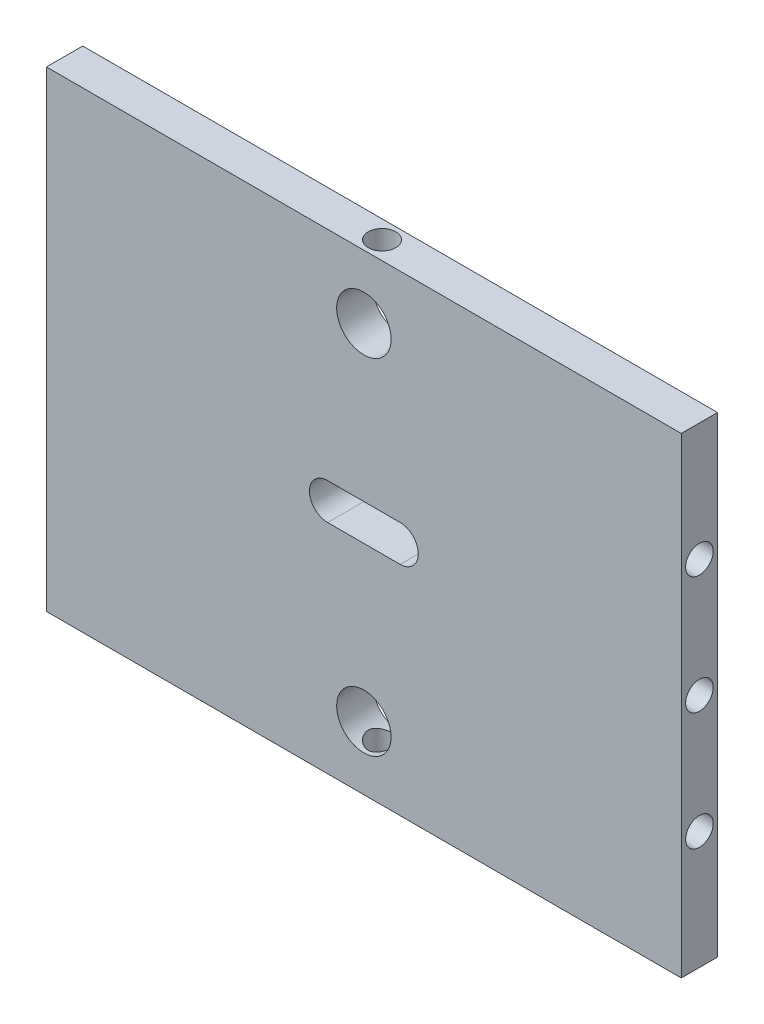
ISO-10303-21;
HEADER;
FILE_DESCRIPTION(('STEP AP214'),'2;1');
FILE_NAME('part.step','',(''),(''),'','','');
FILE_SCHEMA(('AUTOMOTIVE_DESIGN { 1 0 10303 214 1 1 1 1 }'));
ENDSEC;
DATA;
#1=APPLICATION_CONTEXT('core data for automotive mechanical design processes');
#2=APPLICATION_PROTOCOL_DEFINITION('international standard','automotive_design',2000,#1);
#3=PRODUCT_CONTEXT('',#1,'mechanical');
#4=PRODUCT('Part','Part','',(#3));
#5=PRODUCT_RELATED_PRODUCT_CATEGORY('part','',(#4));
#6=PRODUCT_DEFINITION_FORMATION('','',#4);
#7=PRODUCT_DEFINITION_CONTEXT('part definition',#1,'design');
#8=PRODUCT_DEFINITION('design','',#6,#7);
#9=PRODUCT_DEFINITION_SHAPE('','',#8);
#10=(LENGTH_UNIT() NAMED_UNIT(*) SI_UNIT(.MILLI.,.METRE.));
#11=(NAMED_UNIT(*) PLANE_ANGLE_UNIT() SI_UNIT($,.RADIAN.));
#12=(NAMED_UNIT(*) SI_UNIT($,.STERADIAN.) SOLID_ANGLE_UNIT());
#13=UNCERTAINTY_MEASURE_WITH_UNIT(LENGTH_MEASURE(1.E-05),#10,'distance_accuracy_value','');
#14=(GEOMETRIC_REPRESENTATION_CONTEXT(3) GLOBAL_UNCERTAINTY_ASSIGNED_CONTEXT((#13)) GLOBAL_UNIT_ASSIGNED_CONTEXT((#10,
#11,#12)) REPRESENTATION_CONTEXT('',''));
#15=CARTESIAN_POINT('',(0.,0.,0.));
#16=DIRECTION('',(0.,0.,1.));
#17=DIRECTION('',(1.,0.,0.));
#18=AXIS2_PLACEMENT_3D('',#15,#16,#17);
#19=CARTESIAN_POINT('',(55.5625,-41.275,6.35));
#20=DIRECTION('',(0.,1.,0.));
#21=DIRECTION('',(-1.,0.,0.));
#22=AXIS2_PLACEMENT_3D('',#19,#20,#21);
#23=PLANE('',#22);
#24=DIRECTION('',(1.,0.,0.));
#25=VECTOR('',#24,1.);
#26=CARTESIAN_POINT('',(55.5625,-41.275,0.));
#27=LINE('',#26,#25);
#28=CARTESIAN_POINT('',(-55.5625,-41.275,0.));
#29=VERTEX_POINT('',#28);
#30=CARTESIAN_POINT('',(55.5625,-41.275,0.));
#31=VERTEX_POINT('',#30);
#32=EDGE_CURVE('E196',#29,#31,#27,.T.);
#33=ORIENTED_EDGE('',*,*,#32,.T.);
#34=DIRECTION('',(0.,0.,-1.));
#35=VECTOR('',#34,1.);
#36=CARTESIAN_POINT('',(55.5625,-41.275,6.35));
#37=LINE('',#36,#35);
#38=CARTESIAN_POINT('',(55.5625,-41.275,6.35));
#39=VERTEX_POINT('',#38);
#40=EDGE_CURVE('E206',#39,#31,#37,.T.);
#41=ORIENTED_EDGE('',*,*,#40,.F.);
#42=DIRECTION('',(1.,0.,0.));
#43=VECTOR('',#42,1.);
#44=CARTESIAN_POINT('',(55.5625,-41.275,6.35));
#45=LINE('',#44,#43);
#46=CARTESIAN_POINT('',(-55.5625,-41.275,6.35));
#47=VERTEX_POINT('',#46);
#48=EDGE_CURVE('E186',#47,#39,#45,.T.);
#49=ORIENTED_EDGE('',*,*,#48,.F.);
#50=DIRECTION('',(0.,0.,-1.));
#51=VECTOR('',#50,1.);
#52=CARTESIAN_POINT('',(-55.5625,-41.275,6.35));
#53=LINE('',#52,#51);
#54=EDGE_CURVE('E209',#47,#29,#53,.T.);
#55=ORIENTED_EDGE('',*,*,#54,.T.);
#56=EDGE_LOOP('',(#33,#41,#49,#55));
#57=FACE_BOUND('',#56,.T.);
#58=CARTESIAN_POINT('',(0.,-41.275,3.175));
#59=DIRECTION('',(0.,1.,0.));
#60=DIRECTION('',(-1.,0.,0.));
#61=AXIS2_PLACEMENT_3D('',#58,#59,#60);
#62=CIRCLE('',#61,2.413);
#63=CARTESIAN_POINT('',(-2.41299999999999,-41.275,3.175));
#64=VERTEX_POINT('',#63);
#65=EDGE_CURVE('E124',#64,#64,#62,.T.);
#66=ORIENTED_EDGE('',*,*,#65,.T.);
#67=EDGE_LOOP('',(#66));
#68=FACE_BOUND('',#67,.T.);
#69=ADVANCED_FACE('F33',(#57,#68),#23,.F.);
#70=CARTESIAN_POINT('',(0.,-30.1625,6.35));
#71=DIRECTION('',(0.,0.,-1.));
#72=DIRECTION('',(-1.,0.,0.));
#73=AXIS2_PLACEMENT_3D('',#70,#71,#72);
#74=CYLINDRICAL_SURFACE('',#73,4.7625);
#75=CARTESIAN_POINT('',(0.,-30.1625,0.));
#76=DIRECTION('',(0.,0.,1.));
#77=DIRECTION('',(-1.,0.,0.));
#78=AXIS2_PLACEMENT_3D('',#75,#76,#77);
#79=CIRCLE('',#78,4.7625);
#80=CARTESIAN_POINT('',(-4.76249999999999,-30.1625,0.));
#81=VERTEX_POINT('',#80);
#82=EDGE_CURVE('E168',#81,#81,#79,.T.);
#83=ORIENTED_EDGE('',*,*,#82,.F.);
#84=EDGE_LOOP('',(#83));
#85=FACE_BOUND('',#84,.T.);
#86=CARTESIAN_POINT('',(0.,-30.1625,6.35));
#87=DIRECTION('',(0.,0.,1.));
#88=DIRECTION('',(-1.,0.,0.));
#89=AXIS2_PLACEMENT_3D('',#86,#87,#88);
#90=CIRCLE('',#89,4.7625);
#91=CARTESIAN_POINT('',(-4.76249999999999,-30.1625,6.35));
#92=VERTEX_POINT('',#91);
#93=EDGE_CURVE('E171',#92,#92,#90,.T.);
#94=ORIENTED_EDGE('',*,*,#93,.T.);
#95=EDGE_LOOP('',(#94));
#96=FACE_BOUND('',#95,.T.);
#97=CARTESIAN_POINT('',(2.41300000000001,-34.2684514427231,3.175));
#98=CARTESIAN_POINT('',(2.41298959719725,-34.2684642782932,3.30047043207857));
#99=CARTESIAN_POINT('',(2.40314718865454,-34.2742912555838,3.42609849758333));
#100=CARTESIAN_POINT('',(2.36428568016307,-34.2967507465352,3.67347477892594));
#101=CARTESIAN_POINT('',(2.33522736530901,-34.3134053555351,3.79521452596848));
#102=CARTESIAN_POINT('',(2.25952477625305,-34.3550877986089,4.030769610234));
#103=CARTESIAN_POINT('',(2.21297597061041,-34.3800700954961,4.14462406264938));
#104=CARTESIAN_POINT('',(2.10390518974434,-34.4355224660189,4.36287751327027));
#105=CARTESIAN_POINT('',(2.04138198754218,-34.4659929611449,4.46727578432047));
#106=CARTESIAN_POINT('',(1.89592129073469,-34.5321442044983,4.67342732710245));
#107=CARTESIAN_POINT('',(1.81170207851239,-34.5680476684607,4.77420517139413));
#108=CARTESIAN_POINT('',(1.62790296924237,-34.6392235569228,4.96096736840377));
#109=CARTESIAN_POINT('',(1.52831528093832,-34.6744956511623,5.04694417050078));
#110=CARTESIAN_POINT('',(1.30813045270683,-34.7433728760921,5.2075319339098));
#111=CARTESIAN_POINT('',(1.18655293508997,-34.7766906261296,5.28093358665196));
#112=CARTESIAN_POINT('',(0.930770162772574,-34.8349970482044,5.40579547408423));
#113=CARTESIAN_POINT('',(0.796573156353471,-34.8599911128632,5.45726992069383));
#114=CARTESIAN_POINT('',(0.529703085976592,-34.8972259875767,5.53292156586511));
#115=CARTESIAN_POINT('',(0.397629200091036,-34.9102622123706,5.55881198613326));
#116=CARTESIAN_POINT('',(0.130419357459133,-34.925089504113,5.58821217014395));
#117=CARTESIAN_POINT('',(-0.0047146362613206,-34.9268875859818,5.59173589534142));
#118=CARTESIAN_POINT('',(-0.261288495102825,-34.9194045392209,5.57694213264963));
#119=CARTESIAN_POINT('',(-0.382874270437069,-34.9110977758178,5.56054564514285));
#120=CARTESIAN_POINT('',(-0.621292363508594,-34.885822534913,5.50982779049476));
#121=CARTESIAN_POINT('',(-0.738124323984287,-34.8688534077055,5.47550507882298));
#122=CARTESIAN_POINT('',(-0.965723534567066,-34.8275141707143,5.38971157416185));
#123=CARTESIAN_POINT('',(-1.07638734206715,-34.8030470322369,5.33801505128527));
#124=CARTESIAN_POINT('',(-1.28773137967186,-34.7489008749861,5.21926657465877));
#125=CARTESIAN_POINT('',(-1.38840805165303,-34.719220009075,5.15220917623517));
#126=CARTESIAN_POINT('',(-1.5872768433047,-34.6540404063108,4.99722628783866));
#127=CARTESIAN_POINT('',(-1.6842943615511,-34.6182566519651,4.9079124546381));
#128=CARTESIAN_POINT('',(-1.86261687332044,-34.5467119984472,4.71465484311577));
#129=CARTESIAN_POINT('',(-1.94390921550487,-34.5109511405578,4.61069940044455));
#130=CARTESIAN_POINT('',(-2.09378503845431,-34.4409068679264,4.38266528962568));
#131=CARTESIAN_POINT('',(-2.1611638423934,-34.4068798578664,4.25770813256719));
#132=CARTESIAN_POINT('',(-2.27344012148107,-34.3478243240243,3.9961205849381));
#133=CARTESIAN_POINT('',(-2.31836154575336,-34.3227862223101,3.85950281241909));
#134=CARTESIAN_POINT('',(-2.38075232098653,-34.2873788042606,3.5899237169561));
#135=CARTESIAN_POINT('',(-2.40012752840259,-34.2759977087234,3.45754170909794));
#136=CARTESIAN_POINT('',(-2.41663192890407,-34.2663286993642,3.19096185622633));
#137=CARTESIAN_POINT('',(-2.4137778396488,-34.268030946133,3.0567654515499));
#138=CARTESIAN_POINT('',(-2.38765409638552,-34.2832616470244,2.80666634300608));
#139=CARTESIAN_POINT('',(-2.36674462939633,-34.2954222721502,2.69041968011811));
#140=CARTESIAN_POINT('',(-2.30864143407972,-34.3281553265606,2.46331899317455));
#141=CARTESIAN_POINT('',(-2.27144224606701,-34.3487305759492,2.35246679098655));
#142=CARTESIAN_POINT('',(-2.18002666174668,-34.3970801662797,2.13347042165862));
#143=CARTESIAN_POINT('',(-2.12510454857076,-34.425142767739,2.02568694529731));
#144=CARTESIAN_POINT('',(-2.00041157217394,-34.4850620484377,1.82023782562855));
#145=CARTESIAN_POINT('',(-1.93063306308114,-34.5169206775778,1.72257743081149));
#146=CARTESIAN_POINT('',(-1.76760250567714,-34.5858234602435,1.52684674893846));
#147=CARTESIAN_POINT('',(-1.6724774599989,-34.6230029165756,1.4303768962286));
#148=CARTESIAN_POINT('',(-1.46683882016201,-34.694789658719,1.25424873069539));
#149=CARTESIAN_POINT('',(-1.35631960201397,-34.7293959973679,1.17459658880315));
#150=CARTESIAN_POINT('',(-1.11866661604913,-34.7934341488521,1.03236901423491));
#151=CARTESIAN_POINT('',(-0.991142595441608,-34.8226858249857,0.970358728177169));
#152=CARTESIAN_POINT('',(-0.725564086775186,-34.8713345763698,0.869298241995003));
#153=CARTESIAN_POINT('',(-0.587519213640791,-34.890740528229,0.830227355382719));
#154=CARTESIAN_POINT('',(-0.318716713889223,-34.9160595250824,0.779604976418332));
#155=CARTESIAN_POINT('',(-0.188480545270583,-34.923062367338,0.765826368972122));
#156=CARTESIAN_POINT('',(0.0726155489410017,-34.9262328990153,0.759564702235895));
#157=CARTESIAN_POINT('',(0.203475226036689,-34.9224045946478,0.767073769090063));
#158=CARTESIAN_POINT('',(0.452608925002284,-34.9049768331079,0.801722738961749));
#159=CARTESIAN_POINT('',(0.571129388396251,-34.8920678190175,0.82747636285195));
#160=CARTESIAN_POINT('',(0.801961054799566,-34.8584426519233,0.89598079860148));
#161=CARTESIAN_POINT('',(0.914271387194137,-34.8377254074291,0.938733986827927));
#162=CARTESIAN_POINT('',(1.13480267260668,-34.7892605504202,1.0418727993198));
#163=CARTESIAN_POINT('',(1.24265424239447,-34.7612543979166,1.1029230643282));
#164=CARTESIAN_POINT('',(1.4470197310289,-34.7011018355011,1.2400917930215));
#165=CARTESIAN_POINT('',(1.5435284410426,-34.6689535375412,1.31621713668873));
#166=CARTESIAN_POINT('',(1.73283872849973,-34.5998229519975,1.49035967367612));
#167=CARTESIAN_POINT('',(1.82426234873218,-34.562681756181,1.58981666924796));
#168=CARTESIAN_POINT('',(1.98965098475985,-34.4904159810185,1.80310011518249));
#169=CARTESIAN_POINT('',(2.06359983116589,-34.4552932919555,1.9169397254815));
#170=CARTESIAN_POINT('',(2.1942476612967,-34.3900569759987,2.16127032390193));
#171=CARTESIAN_POINT('',(2.25023530606393,-34.3601673604939,2.29221115944626));
#172=CARTESIAN_POINT('',(2.31646335056276,-34.3237529237911,2.49554634679165));
#173=CARTESIAN_POINT('',(2.33557123649977,-34.3130239825891,2.56441372758246));
#174=CARTESIAN_POINT('',(2.36765850523188,-34.2948049420943,2.70396433617474));
#175=CARTESIAN_POINT('',(2.38064213124901,-34.2873126006123,2.77464627084623));
#176=CARTESIAN_POINT('',(2.39794173497482,-34.2772728821239,2.90029767745757));
#177=CARTESIAN_POINT('',(2.40358148617512,-34.273975041233,2.95502919936537));
#178=CARTESIAN_POINT('',(2.41111302876599,-34.2695614298812,3.06483033264054));
#179=CARTESIAN_POINT('',(2.41300456836541,-34.2684458060139,3.11989996647179));
#180=CARTESIAN_POINT('',(2.41300000000001,-34.2684514427231,3.175));
#181=B_SPLINE_CURVE_WITH_KNOTS('',3,(#97,#98,#99,#100,#101,#102,#103,#104,#105,#106,#107,#108,
#109,#110,#111,#112,#113,#114,#115,#116,#117,#118,#119,#120,#121,#122,#123,#124,#125,#126,#127,
#128,#129,#130,#131,#132,#133,#134,#135,#136,#137,#138,#139,#140,#141,#142,#143,#144,#145,#146,
#147,#148,#149,#150,#151,#152,#153,#154,#155,#156,#157,#158,#159,#160,#161,#162,#163,#164,#165,
#166,#167,#168,#169,#170,#171,#172,#173,#174,#175,#176,#177,#178,#179,#180),.UNSPECIFIED.,.T.,
.F.,(4,2,2,2,2,2,2,2,2,2,2,2,2,2,2,2,2,2,2,2,2,2,2,2,2,2,2,2,2,2,2,2,2,2,2,2,2,2,2,2,2,4),(0.,
0.37618822892474,0.753146543850161,1.12807650665735,1.50303527615293,1.90979790652876,
2.31676743228543,2.75209273661076,3.18713545790192,3.59053368294288,3.99368007907376,
4.36085058994704,4.72804864386794,5.1002148759916,5.47251322738946,5.88069274414447,
6.28919929911487,6.72487227779818,7.16007964726322,7.56053080596972,7.96068083237494,
8.31529503877274,8.67002818923127,9.04112183933797,9.41240693714612,9.8320075188292,
10.2517617982206,10.6837456980933,11.1153394390999,11.5066726658481,11.8978611656857,
12.262133362244,12.6264564982826,13.0060681057285,13.3858533617061,13.8043077188214,
14.2231477683155,14.6569640464722,14.8734832858582,15.0898522877214,15.2550433322878,
15.4202454734081),.UNSPECIFIED.);
#182=CARTESIAN_POINT('',(2.41300000000001,-34.2684514427231,3.175));
#183=VERTEX_POINT('',#182);
#184=EDGE_CURVE('E129',#183,#183,#181,.T.);
#185=ORIENTED_EDGE('',*,*,#184,.T.);
#186=EDGE_LOOP('',(#185));
#187=FACE_BOUND('',#186,.T.);
#188=ADVANCED_FACE('F282',(#85,#96,#187),#74,.F.);
#189=CARTESIAN_POINT('',(-55.5625,-41.275,6.35));
#190=DIRECTION('',(1.,0.,0.));
#191=DIRECTION('',(0.,0.,-1.));
#192=AXIS2_PLACEMENT_3D('',#189,#190,#191);
#193=PLANE('',#192);
#194=CARTESIAN_POINT('',(-55.5625,0.,3.175));
#195=DIRECTION('',(1.,0.,0.));
#196=DIRECTION('',(0.,0.,-1.));
#197=AXIS2_PLACEMENT_3D('',#194,#195,#196);
#198=CIRCLE('',#197,2.413);
#199=CARTESIAN_POINT('',(-55.5625,0.,0.762));
#200=VERTEX_POINT('',#199);
#201=EDGE_CURVE('E137',#200,#200,#198,.T.);
#202=ORIENTED_EDGE('',*,*,#201,.T.);
#203=EDGE_LOOP('',(#202));
#204=FACE_BOUND('',#203,.T.);
#205=DIRECTION('',(0.,-1.,0.));
#206=VECTOR('',#205,1.);
#207=CARTESIAN_POINT('',(-55.5625,-41.275,0.));
#208=LINE('',#207,#206);
#209=CARTESIAN_POINT('',(-55.5625,41.275,0.));
#210=VERTEX_POINT('',#209);
#211=EDGE_CURVE('E180',#210,#29,#208,.T.);
#212=ORIENTED_EDGE('',*,*,#211,.T.);
#213=ORIENTED_EDGE('',*,*,#54,.F.);
#214=DIRECTION('',(0.,-1.,0.));
#215=VECTOR('',#214,1.);
#216=CARTESIAN_POINT('',(-55.5625,-41.275,6.35));
#217=LINE('',#216,#215);
#218=CARTESIAN_POINT('',(-55.5625,41.275,6.35));
#219=VERTEX_POINT('',#218);
#220=EDGE_CURVE('E183',#219,#47,#217,.T.);
#221=ORIENTED_EDGE('',*,*,#220,.F.);
#222=DIRECTION('',(0.,0.,-1.));
#223=VECTOR('',#222,1.);
#224=CARTESIAN_POINT('',(-55.5625,41.275,6.35));
#225=LINE('',#224,#223);
#226=EDGE_CURVE('E193',#219,#210,#225,.T.);
#227=ORIENTED_EDGE('',*,*,#226,.T.);
#228=EDGE_LOOP('',(#212,#213,#221,#227));
#229=FACE_BOUND('',#228,.T.);
#230=CARTESIAN_POINT('',(-55.5625,20.6375,3.175));
#231=DIRECTION('',(1.,0.,0.));
#232=DIRECTION('',(0.,0.,-1.));
#233=AXIS2_PLACEMENT_3D('',#230,#231,#232);
#234=CIRCLE('',#233,2.413);
#235=CARTESIAN_POINT('',(-55.5625,20.6375,0.762));
#236=VERTEX_POINT('',#235);
#237=EDGE_CURVE('E144',#236,#236,#234,.T.);
#238=ORIENTED_EDGE('',*,*,#237,.T.);
#239=EDGE_LOOP('',(#238));
#240=FACE_BOUND('',#239,.T.);
#241=CARTESIAN_POINT('',(-55.5625,-20.6375,3.175));
#242=DIRECTION('',(1.,0.,0.));
#243=DIRECTION('',(0.,0.,-1.));
#244=AXIS2_PLACEMENT_3D('',#241,#242,#243);
#245=CIRCLE('',#244,2.413);
#246=CARTESIAN_POINT('',(-55.5625,-20.6375,0.762));
#247=VERTEX_POINT('',#246);
#248=EDGE_CURVE('E138',#247,#247,#245,.T.);
#249=ORIENTED_EDGE('',*,*,#248,.T.);
#250=EDGE_LOOP('',(#249));
#251=FACE_BOUND('',#250,.T.);
#252=ADVANCED_FACE('F35',(#204,#229,#240,#251),#193,.F.);
#253=CARTESIAN_POINT('',(0.,0.,6.35));
#254=DIRECTION('',(0.,0.,1.));
#255=DIRECTION('',(1.,0.,0.));
#256=AXIS2_PLACEMENT_3D('',#253,#254,#255);
#257=PLANE('',#256);
#258=CARTESIAN_POINT('',(-6.35,0.,6.35));
#259=DIRECTION('',(0.,0.,1.));
#260=DIRECTION('',(1.,0.,0.));
#261=AXIS2_PLACEMENT_3D('',#258,#259,#260);
#262=CIRCLE('',#261,3.175);
#263=CARTESIAN_POINT('',(-6.35,3.175,6.35));
#264=VERTEX_POINT('',#263);
#265=CARTESIAN_POINT('',(-6.35,-3.175,6.35));
#266=VERTEX_POINT('',#265);
#267=EDGE_CURVE('E48',#264,#266,#262,.T.);
#268=ORIENTED_EDGE('',*,*,#267,.F.);
#269=DIRECTION('',(-1.,0.,0.));
#270=VECTOR('',#269,1.);
#271=CARTESIAN_POINT('',(-6.35,3.175,6.35));
#272=LINE('',#271,#270);
#273=CARTESIAN_POINT('',(6.35,3.175,6.35));
#274=VERTEX_POINT('',#273);
#275=EDGE_CURVE('E117',#274,#264,#272,.T.);
#276=ORIENTED_EDGE('',*,*,#275,.F.);
#277=CARTESIAN_POINT('',(6.35,0.,6.35));
#278=DIRECTION('',(0.,0.,1.));
#279=DIRECTION('',(1.,0.,0.));
#280=AXIS2_PLACEMENT_3D('',#277,#278,#279);
#281=CIRCLE('',#280,3.175);
#282=CARTESIAN_POINT('',(6.35,-3.175,6.35));
#283=VERTEX_POINT('',#282);
#284=EDGE_CURVE('E101',#283,#274,#281,.T.);
#285=ORIENTED_EDGE('',*,*,#284,.F.);
#286=DIRECTION('',(1.,0.,0.));
#287=VECTOR('',#286,1.);
#288=CARTESIAN_POINT('',(-6.35,-3.175,6.35));
#289=LINE('',#288,#287);
#290=EDGE_CURVE('E110',#266,#283,#289,.T.);
#291=ORIENTED_EDGE('',*,*,#290,.F.);
#292=EDGE_LOOP('',(#268,#276,#285,#291));
#293=FACE_BOUND('',#292,.T.);
#294=CARTESIAN_POINT('',(0.,30.1625,6.35));
#295=DIRECTION('',(0.,0.,1.));
#296=DIRECTION('',(1.,0.,0.));
#297=AXIS2_PLACEMENT_3D('',#294,#295,#296);
#298=CIRCLE('',#297,4.7625);
#299=CARTESIAN_POINT('',(4.76250000000001,30.1625,6.35));
#300=VERTEX_POINT('',#299);
#301=EDGE_CURVE('E177',#300,#300,#298,.T.);
#302=ORIENTED_EDGE('',*,*,#301,.F.);
#303=EDGE_LOOP('',(#302));
#304=FACE_BOUND('',#303,.T.);
#305=ORIENTED_EDGE('',*,*,#220,.T.);
#306=ORIENTED_EDGE('',*,*,#48,.T.);
#307=DIRECTION('',(0.,1.,0.));
#308=VECTOR('',#307,1.);
#309=CARTESIAN_POINT('',(55.5625,-41.275,6.35));
#310=LINE('',#309,#308);
#311=CARTESIAN_POINT('',(55.5625,41.275,6.35));
#312=VERTEX_POINT('',#311);
#313=EDGE_CURVE('E189',#39,#312,#310,.T.);
#314=ORIENTED_EDGE('',*,*,#313,.T.);
#315=DIRECTION('',(-1.,0.,0.));
#316=VECTOR('',#315,1.);
#317=CARTESIAN_POINT('',(55.5625,41.275,6.35));
#318=LINE('',#317,#316);
#319=EDGE_CURVE('E191',#312,#219,#318,.T.);
#320=ORIENTED_EDGE('',*,*,#319,.T.);
#321=EDGE_LOOP('',(#305,#306,#314,#320));
#322=FACE_BOUND('',#321,.T.);
#323=ORIENTED_EDGE('',*,*,#93,.F.);
#324=EDGE_LOOP('',(#323));
#325=FACE_BOUND('',#324,.T.);
#326=ADVANCED_FACE('F114',(#293,#304,#322,#325),#257,.T.);
#327=CARTESIAN_POINT('',(0.,0.,0.));
#328=DIRECTION('',(0.,0.,1.));
#329=DIRECTION('',(1.,0.,0.));
#330=AXIS2_PLACEMENT_3D('',#327,#328,#329);
#331=PLANE('',#330);
#332=DIRECTION('',(-1.,0.,0.));
#333=VECTOR('',#332,1.);
#334=CARTESIAN_POINT('',(0.,3.175,0.));
#335=LINE('',#334,#333);
#336=CARTESIAN_POINT('',(6.35,3.175,0.));
#337=VERTEX_POINT('',#336);
#338=CARTESIAN_POINT('',(-6.35,3.175,0.));
#339=VERTEX_POINT('',#338);
#340=EDGE_CURVE('E41',#337,#339,#335,.T.);
#341=ORIENTED_EDGE('',*,*,#340,.T.);
#342=CARTESIAN_POINT('',(-6.35,0.,0.));
#343=DIRECTION('',(0.,0.,1.));
#344=DIRECTION('',(1.,0.,0.));
#345=AXIS2_PLACEMENT_3D('',#342,#343,#344);
#346=CIRCLE('',#345,3.175);
#347=CARTESIAN_POINT('',(-6.35,-3.175,0.));
#348=VERTEX_POINT('',#347);
#349=EDGE_CURVE('E11',#339,#348,#346,.T.);
#350=ORIENTED_EDGE('',*,*,#349,.T.);
#351=DIRECTION('',(1.,0.,0.));
#352=VECTOR('',#351,1.);
#353=CARTESIAN_POINT('',(0.,-3.175,0.));
#354=LINE('',#353,#352);
#355=CARTESIAN_POINT('',(6.35,-3.175,0.));
#356=VERTEX_POINT('',#355);
#357=EDGE_CURVE('E212',#348,#356,#354,.T.);
#358=ORIENTED_EDGE('',*,*,#357,.T.);
#359=CARTESIAN_POINT('',(6.35,0.,0.));
#360=DIRECTION('',(0.,0.,1.));
#361=DIRECTION('',(1.,0.,0.));
#362=AXIS2_PLACEMENT_3D('',#359,#360,#361);
#363=CIRCLE('',#362,3.175);
#364=EDGE_CURVE('E104',#356,#337,#363,.T.);
#365=ORIENTED_EDGE('',*,*,#364,.T.);
#366=EDGE_LOOP('',(#341,#350,#358,#365));
#367=FACE_BOUND('',#366,.T.);
#368=CARTESIAN_POINT('',(0.,30.1625,0.));
#369=DIRECTION('',(0.,0.,1.));
#370=DIRECTION('',(1.,0.,0.));
#371=AXIS2_PLACEMENT_3D('',#368,#369,#370);
#372=CIRCLE('',#371,4.7625);
#373=CARTESIAN_POINT('',(4.76250000000001,30.1625,0.));
#374=VERTEX_POINT('',#373);
#375=EDGE_CURVE('E174',#374,#374,#372,.T.);
#376=ORIENTED_EDGE('',*,*,#375,.T.);
#377=EDGE_LOOP('',(#376));
#378=FACE_BOUND('',#377,.T.);
#379=ORIENTED_EDGE('',*,*,#211,.F.);
#380=DIRECTION('',(-1.,0.,0.));
#381=VECTOR('',#380,1.);
#382=CARTESIAN_POINT('',(55.5625,41.275,0.));
#383=LINE('',#382,#381);
#384=CARTESIAN_POINT('',(55.5625,41.275,0.));
#385=VERTEX_POINT('',#384);
#386=EDGE_CURVE('E187',#385,#210,#383,.T.);
#387=ORIENTED_EDGE('',*,*,#386,.F.);
#388=DIRECTION('',(0.,1.,0.));
#389=VECTOR('',#388,1.);
#390=CARTESIAN_POINT('',(55.5625,-41.275,0.));
#391=LINE('',#390,#389);
#392=EDGE_CURVE('E198',#31,#385,#391,.T.);
#393=ORIENTED_EDGE('',*,*,#392,.F.);
#394=ORIENTED_EDGE('',*,*,#32,.F.);
#395=EDGE_LOOP('',(#379,#387,#393,#394));
#396=FACE_BOUND('',#395,.T.);
#397=ORIENTED_EDGE('',*,*,#82,.T.);
#398=EDGE_LOOP('',(#397));
#399=FACE_BOUND('',#398,.T.);
#400=ADVANCED_FACE('F447',(#367,#378,#396,#399),#331,.F.);
#401=CARTESIAN_POINT('',(55.5625,-41.275,6.35));
#402=DIRECTION('',(-1.,0.,0.));
#403=DIRECTION('',(0.,0.,1.));
#404=AXIS2_PLACEMENT_3D('',#401,#402,#403);
#405=PLANE('',#404);
#406=CARTESIAN_POINT('',(55.5625,-20.6375,3.175));
#407=DIRECTION('',(1.,0.,0.));
#408=DIRECTION('',(0.,0.,-1.));
#409=AXIS2_PLACEMENT_3D('',#406,#407,#408);
#410=CIRCLE('',#409,2.413);
#411=CARTESIAN_POINT('',(55.5625,-20.6375,0.762));
#412=VERTEX_POINT('',#411);
#413=EDGE_CURVE('E150',#412,#412,#410,.T.);
#414=ORIENTED_EDGE('',*,*,#413,.F.);
#415=EDGE_LOOP('',(#414));
#416=FACE_BOUND('',#415,.T.);
#417=CARTESIAN_POINT('',(55.5625,0.,3.175));
#418=DIRECTION('',(1.,0.,0.));
#419=DIRECTION('',(0.,0.,-1.));
#420=AXIS2_PLACEMENT_3D('',#417,#418,#419);
#421=CIRCLE('',#420,2.413);
#422=CARTESIAN_POINT('',(55.5625,0.,0.762));
#423=VERTEX_POINT('',#422);
#424=EDGE_CURVE('E156',#423,#423,#421,.T.);
#425=ORIENTED_EDGE('',*,*,#424,.F.);
#426=EDGE_LOOP('',(#425));
#427=FACE_BOUND('',#426,.T.);
#428=CARTESIAN_POINT('',(55.5625,20.6375,3.175));
#429=DIRECTION('',(1.,0.,0.));
#430=DIRECTION('',(0.,0.,-1.));
#431=AXIS2_PLACEMENT_3D('',#428,#429,#430);
#432=CIRCLE('',#431,2.413);
#433=CARTESIAN_POINT('',(55.5625,20.6375,0.762));
#434=VERTEX_POINT('',#433);
#435=EDGE_CURVE('E162',#434,#434,#432,.T.);
#436=ORIENTED_EDGE('',*,*,#435,.F.);
#437=EDGE_LOOP('',(#436));
#438=FACE_BOUND('',#437,.T.);
#439=ORIENTED_EDGE('',*,*,#392,.T.);
#440=DIRECTION('',(0.,0.,-1.));
#441=VECTOR('',#440,1.);
#442=CARTESIAN_POINT('',(55.5625,41.275,6.35));
#443=LINE('',#442,#441);
#444=EDGE_CURVE('E203',#312,#385,#443,.T.);
#445=ORIENTED_EDGE('',*,*,#444,.F.);
#446=ORIENTED_EDGE('',*,*,#313,.F.);
#447=ORIENTED_EDGE('',*,*,#40,.T.);
#448=EDGE_LOOP('',(#439,#445,#446,#447));
#449=FACE_BOUND('',#448,.T.);
#450=ADVANCED_FACE('F439',(#416,#427,#438,#449),#405,.F.);
#451=CARTESIAN_POINT('',(55.5625,41.275,6.35));
#452=DIRECTION('',(0.,-1.,0.));
#453=DIRECTION('',(1.,0.,0.));
#454=AXIS2_PLACEMENT_3D('',#451,#452,#453);
#455=PLANE('',#454);
#456=CARTESIAN_POINT('',(0.,41.275,3.175));
#457=DIRECTION('',(0.,1.,0.));
#458=DIRECTION('',(-1.,0.,0.));
#459=AXIS2_PLACEMENT_3D('',#456,#457,#458);
#460=CIRCLE('',#459,2.413);
#461=CARTESIAN_POINT('',(-2.41299999999999,41.275,3.175));
#462=VERTEX_POINT('',#461);
#463=EDGE_CURVE('E130',#462,#462,#460,.T.);
#464=ORIENTED_EDGE('',*,*,#463,.F.);
#465=EDGE_LOOP('',(#464));
#466=FACE_BOUND('',#465,.T.);
#467=ORIENTED_EDGE('',*,*,#386,.T.);
#468=ORIENTED_EDGE('',*,*,#226,.F.);
#469=ORIENTED_EDGE('',*,*,#319,.F.);
#470=ORIENTED_EDGE('',*,*,#444,.T.);
#471=EDGE_LOOP('',(#467,#468,#469,#470));
#472=FACE_BOUND('',#471,.T.);
#473=ADVANCED_FACE('F432',(#466,#472),#455,.F.);
#474=CARTESIAN_POINT('',(0.,30.1625,6.35));
#475=DIRECTION('',(0.,0.,-1.));
#476=DIRECTION('',(-1.,0.,0.));
#477=AXIS2_PLACEMENT_3D('',#474,#475,#476);
#478=CYLINDRICAL_SURFACE('',#477,4.7625);
#479=CARTESIAN_POINT('',(-2.41299999999999,34.2684514427231,3.175));
#480=CARTESIAN_POINT('',(-2.41298959719723,34.2684642782932,3.04952956792143));
#481=CARTESIAN_POINT('',(-2.40314718865452,34.2742912555838,2.92390150241667));
#482=CARTESIAN_POINT('',(-2.36428568016305,34.2967507465352,2.67652522107406));
#483=CARTESIAN_POINT('',(-2.33522736530899,34.3134053555351,2.55478547403152));
#484=CARTESIAN_POINT('',(-2.25952477625303,34.3550877986089,2.319230389766));
#485=CARTESIAN_POINT('',(-2.21297597061039,34.3800700954961,2.20537593735062));
#486=CARTESIAN_POINT('',(-2.10390518974432,34.4355224660189,1.98712248672973));
#487=CARTESIAN_POINT('',(-2.04138198754215,34.4659929611449,1.88272421567953));
#488=CARTESIAN_POINT('',(-1.89592129073467,34.5321442044983,1.67657267289755));
#489=CARTESIAN_POINT('',(-1.81170207851237,34.5680476684607,1.57579482860587));
#490=CARTESIAN_POINT('',(-1.62790296924235,34.6392235569228,1.38903263159623));
#491=CARTESIAN_POINT('',(-1.5283152809383,34.6744956511623,1.30305582949922));
#492=CARTESIAN_POINT('',(-1.30813045270681,34.7433728760921,1.1424680660902));
#493=CARTESIAN_POINT('',(-1.18655293508995,34.7766906261296,1.06906641334804));
#494=CARTESIAN_POINT('',(-0.930770162772554,34.8349970482044,0.944204525915773));
#495=CARTESIAN_POINT('',(-0.796573156353452,34.8599911128632,0.892730079306169));
#496=CARTESIAN_POINT('',(-0.529703085976573,34.8972259875767,0.817078434134892));
#497=CARTESIAN_POINT('',(-0.397629200091017,34.9102622123706,0.791188013866745));
#498=CARTESIAN_POINT('',(-0.130419357459115,34.925089504113,0.76178782985605));
#499=CARTESIAN_POINT('',(0.0047146362613396,34.9268875859818,0.75826410465858));
#500=CARTESIAN_POINT('',(0.261288495102843,34.9194045392209,0.773057867350371));
#501=CARTESIAN_POINT('',(0.382874270437086,34.9110977758178,0.789454354857148));
#502=CARTESIAN_POINT('',(0.621292363508612,34.885822534913,0.840172209505244));
#503=CARTESIAN_POINT('',(0.738124323984305,34.8688534077055,0.874494921177024));
#504=CARTESIAN_POINT('',(0.965723534567085,34.8275141707143,0.960288425838147));
#505=CARTESIAN_POINT('',(1.07638734206716,34.8030470322369,1.01198494871473));
#506=CARTESIAN_POINT('',(1.28773137967188,34.7489008749861,1.13073342534123));
#507=CARTESIAN_POINT('',(1.38840805165305,34.719220009075,1.19779082376483));
#508=CARTESIAN_POINT('',(1.58727684330472,34.6540404063108,1.35277371216134));
#509=CARTESIAN_POINT('',(1.68429436155112,34.6182566519651,1.4420875453619));
#510=CARTESIAN_POINT('',(1.86261687332046,34.5467119984472,1.63534515688423));
#511=CARTESIAN_POINT('',(1.94390921550489,34.5109511405578,1.73930059955545));
#512=CARTESIAN_POINT('',(2.09378503845433,34.4409068679264,1.96733471037432));
#513=CARTESIAN_POINT('',(2.16116384239342,34.4068798578664,2.09229186743281));
#514=CARTESIAN_POINT('',(2.27344012148109,34.3478243240243,2.3538794150619));
#515=CARTESIAN_POINT('',(2.31836154575338,34.3227862223101,2.49049718758091));
#516=CARTESIAN_POINT('',(2.38075232098655,34.2873788042606,2.7600762830439));
#517=CARTESIAN_POINT('',(2.40012752840261,34.2759977087234,2.89245829090206));
#518=CARTESIAN_POINT('',(2.41663192890409,34.2663286993641,3.15903814377367));
#519=CARTESIAN_POINT('',(2.41377783964882,34.268030946133,3.2932345484501));
#520=CARTESIAN_POINT('',(2.38765409638554,34.2832616470244,3.54333365699392));
#521=CARTESIAN_POINT('',(2.36674462939635,34.2954222721502,3.65958031988189));
#522=CARTESIAN_POINT('',(2.30864143407974,34.3281553265606,3.88668100682545));
#523=CARTESIAN_POINT('',(2.27144224606703,34.3487305759492,3.99753320901345));
#524=CARTESIAN_POINT('',(2.1800266617467,34.3970801662797,4.21652957834138));
#525=CARTESIAN_POINT('',(2.12510454857078,34.425142767739,4.32431305470269));
#526=CARTESIAN_POINT('',(2.00041157217396,34.4850620484377,4.52976217437145));
#527=CARTESIAN_POINT('',(1.93063306308116,34.5169206775778,4.62742256918851));
#528=CARTESIAN_POINT('',(1.76760250567716,34.5858234602435,4.82315325106154));
#529=CARTESIAN_POINT('',(1.67247745999892,34.6230029165756,4.9196231037714));
#530=CARTESIAN_POINT('',(1.46683882016203,34.694789658719,5.09575126930461));
#531=CARTESIAN_POINT('',(1.35631960201399,34.729395997368,5.17540341119684));
#532=CARTESIAN_POINT('',(1.11866661604915,34.7934341488521,5.31763098576508));
#533=CARTESIAN_POINT('',(0.99114259544163,34.8226858249857,5.37964127182283));
#534=CARTESIAN_POINT('',(0.725564086775207,34.8713345763698,5.480701758005));
#535=CARTESIAN_POINT('',(0.587519213640812,34.890740528229,5.51977264461728));
#536=CARTESIAN_POINT('',(0.318716713889244,34.9160595250824,5.57039502358167));
#537=CARTESIAN_POINT('',(0.188480545270604,34.923062367338,5.58417363102788));
#538=CARTESIAN_POINT('',(-0.0726155489409811,34.9262328990153,5.59043529776411));
#539=CARTESIAN_POINT('',(-0.203475226036669,34.9224045946478,5.58292623090994));
#540=CARTESIAN_POINT('',(-0.452608925002264,34.9049768331079,5.54827726103825));
#541=CARTESIAN_POINT('',(-0.571129388396231,34.8920678190175,5.52252363714805));
#542=CARTESIAN_POINT('',(-0.801961054799546,34.8584426519233,5.45401920139852));
#543=CARTESIAN_POINT('',(-0.914271387194117,34.8377254074291,5.41126601317207));
#544=CARTESIAN_POINT('',(-1.13480267260666,34.7892605504202,5.3081272006802));
#545=CARTESIAN_POINT('',(-1.24265424239445,34.7612543979166,5.2470769356718));
#546=CARTESIAN_POINT('',(-1.44701973102888,34.7011018355011,5.1099082069785));
#547=CARTESIAN_POINT('',(-1.54352844104258,34.6689535375412,5.03378286331128));
#548=CARTESIAN_POINT('',(-1.73283872849971,34.5998229519975,4.85964032632388));
#549=CARTESIAN_POINT('',(-1.82426234873216,34.562681756181,4.76018333075204));
#550=CARTESIAN_POINT('',(-1.98965098475983,34.4904159810185,4.54689988481751));
#551=CARTESIAN_POINT('',(-2.06359983116587,34.4552932919555,4.4330602745185));
#552=CARTESIAN_POINT('',(-2.19424766129668,34.3900569759987,4.18872967609807));
#553=CARTESIAN_POINT('',(-2.25023530606391,34.3601673604939,4.05778884055374));
#554=CARTESIAN_POINT('',(-2.31646335056274,34.3237529237911,3.85445365320835));
#555=CARTESIAN_POINT('',(-2.33557123649975,34.3130239825891,3.78558627241754));
#556=CARTESIAN_POINT('',(-2.36765850523186,34.2948049420943,3.64603566382526));
#557=CARTESIAN_POINT('',(-2.38064213124899,34.2873126006123,3.57535372915377));
#558=CARTESIAN_POINT('',(-2.3979417349748,34.2772728821239,3.44970232254243));
#559=CARTESIAN_POINT('',(-2.4035814861751,34.273975041233,3.39497080063464));
#560=CARTESIAN_POINT('',(-2.41111302876597,34.2695614298812,3.28516966735946));
#561=CARTESIAN_POINT('',(-2.41300456836539,34.2684458060139,3.23010003352821));
#562=CARTESIAN_POINT('',(-2.41299999999999,34.2684514427231,3.175));
#563=B_SPLINE_CURVE_WITH_KNOTS('',3,(#479,#480,#481,#482,#483,#484,#485,#486,#487,#488,#489,
#490,#491,#492,#493,#494,#495,#496,#497,#498,#499,#500,#501,#502,#503,#504,#505,#506,#507,#508,
#509,#510,#511,#512,#513,#514,#515,#516,#517,#518,#519,#520,#521,#522,#523,#524,#525,#526,#527,
#528,#529,#530,#531,#532,#533,#534,#535,#536,#537,#538,#539,#540,#541,#542,#543,#544,#545,#546,
#547,#548,#549,#550,#551,#552,#553,#554,#555,#556,#557,#558,#559,#560,#561,#562),.UNSPECIFIED.,
.T.,.F.,(4,2,2,2,2,2,2,2,2,2,2,2,2,2,2,2,2,2,2,2,2,2,2,2,2,2,2,2,2,2,2,2,2,2,2,2,2,2,2,2,2,4),
(0.,0.37618822892474,0.753146543850162,1.12807650665736,1.50303527615293,1.90979790652877,
2.31676743228543,2.75209273661076,3.18713545790192,3.59053368294287,3.99368007907376,
4.36085058994704,4.72804864386794,5.10021487599159,5.47251322738946,5.88069274414447,
6.28919929911486,6.72487227779818,7.16007964726322,7.56053080596972,7.96068083237494,
8.31529503877274,8.67002818923127,9.04112183933797,9.41240693714612,9.8320075188292,
10.2517617982206,10.6837456980933,11.1153394390999,11.5066726658481,11.8978611656857,
12.262133362244,12.6264564982826,13.0060681057285,13.3858533617061,13.8043077188214,
14.2231477683155,14.6569640464722,14.8734832858582,15.0898522877214,15.2550433322878,
15.4202454734081),.UNSPECIFIED.);
#564=CARTESIAN_POINT('',(-2.41299999999999,34.2684514427231,3.175));
#565=VERTEX_POINT('',#564);
#566=EDGE_CURVE('E133',#565,#565,#563,.T.);
#567=ORIENTED_EDGE('',*,*,#566,.F.);
#568=EDGE_LOOP('',(#567));
#569=FACE_BOUND('',#568,.T.);
#570=ORIENTED_EDGE('',*,*,#301,.T.);
#571=EDGE_LOOP('',(#570));
#572=FACE_BOUND('',#571,.T.);
#573=ORIENTED_EDGE('',*,*,#375,.F.);
#574=EDGE_LOOP('',(#573));
#575=FACE_BOUND('',#574,.T.);
#576=ADVANCED_FACE('F224',(#569,#572,#575),#478,.F.);
#577=CARTESIAN_POINT('',(42.8625,20.6375,3.175));
#578=DIRECTION('',(1.,0.,0.));
#579=DIRECTION('',(0.,0.,-1.));
#580=AXIS2_PLACEMENT_3D('',#577,#578,#579);
#581=CYLINDRICAL_SURFACE('',#580,2.413);
#582=CARTESIAN_POINT('',(42.8625,20.6375,3.175));
#583=DIRECTION('',(1.,0.,0.));
#584=DIRECTION('',(0.,0.,-1.));
#585=AXIS2_PLACEMENT_3D('',#582,#583,#584);
#586=CIRCLE('',#585,2.413);
#587=CARTESIAN_POINT('',(42.8625,20.6375,0.762));
#588=VERTEX_POINT('',#587);
#589=EDGE_CURVE('E165',#588,#588,#586,.T.);
#590=ORIENTED_EDGE('',*,*,#589,.F.);
#591=EDGE_LOOP('',(#590));
#592=FACE_BOUND('',#591,.T.);
#593=ORIENTED_EDGE('',*,*,#435,.T.);
#594=EDGE_LOOP('',(#593));
#595=FACE_BOUND('',#594,.T.);
#596=ADVANCED_FACE('F278',(#592,#595),#581,.F.);
#597=CARTESIAN_POINT('',(42.8625,20.6375,3.175));
#598=DIRECTION('',(1.,0.,0.));
#599=DIRECTION('',(0.,0.,-1.));
#600=AXIS2_PLACEMENT_3D('',#597,#598,#599);
#601=PLANE('',#600);
#602=ORIENTED_EDGE('',*,*,#589,.T.);
#603=EDGE_LOOP('',(#602));
#604=FACE_BOUND('',#603,.T.);
#605=ADVANCED_FACE('F274',(#604),#601,.T.);
#606=CARTESIAN_POINT('',(42.8625,0.,3.175));
#607=DIRECTION('',(1.,0.,0.));
#608=DIRECTION('',(0.,0.,-1.));
#609=AXIS2_PLACEMENT_3D('',#606,#607,#608);
#610=CYLINDRICAL_SURFACE('',#609,2.413);
#611=CARTESIAN_POINT('',(42.8625,0.,3.175));
#612=DIRECTION('',(1.,0.,0.));
#613=DIRECTION('',(0.,0.,-1.));
#614=AXIS2_PLACEMENT_3D('',#611,#612,#613);
#615=CIRCLE('',#614,2.413);
#616=CARTESIAN_POINT('',(42.8625,0.,0.762));
#617=VERTEX_POINT('',#616);
#618=EDGE_CURVE('E159',#617,#617,#615,.T.);
#619=ORIENTED_EDGE('',*,*,#618,.F.);
#620=EDGE_LOOP('',(#619));
#621=FACE_BOUND('',#620,.T.);
#622=ORIENTED_EDGE('',*,*,#424,.T.);
#623=EDGE_LOOP('',(#622));
#624=FACE_BOUND('',#623,.T.);
#625=ADVANCED_FACE('F270',(#621,#624),#610,.F.);
#626=CARTESIAN_POINT('',(42.8625,0.,3.175));
#627=DIRECTION('',(1.,0.,0.));
#628=DIRECTION('',(0.,0.,-1.));
#629=AXIS2_PLACEMENT_3D('',#626,#627,#628);
#630=PLANE('',#629);
#631=ORIENTED_EDGE('',*,*,#618,.T.);
#632=EDGE_LOOP('',(#631));
#633=FACE_BOUND('',#632,.T.);
#634=ADVANCED_FACE('F266',(#633),#630,.T.);
#635=CARTESIAN_POINT('',(42.8625,-20.6375,3.175));
#636=DIRECTION('',(1.,0.,0.));
#637=DIRECTION('',(0.,0.,-1.));
#638=AXIS2_PLACEMENT_3D('',#635,#636,#637);
#639=CYLINDRICAL_SURFACE('',#638,2.413);
#640=CARTESIAN_POINT('',(42.8625,-20.6375,3.175));
#641=DIRECTION('',(1.,0.,0.));
#642=DIRECTION('',(0.,0.,-1.));
#643=AXIS2_PLACEMENT_3D('',#640,#641,#642);
#644=CIRCLE('',#643,2.413);
#645=CARTESIAN_POINT('',(42.8625,-20.6375,0.762));
#646=VERTEX_POINT('',#645);
#647=EDGE_CURVE('E153',#646,#646,#644,.T.);
#648=ORIENTED_EDGE('',*,*,#647,.F.);
#649=EDGE_LOOP('',(#648));
#650=FACE_BOUND('',#649,.T.);
#651=ORIENTED_EDGE('',*,*,#413,.T.);
#652=EDGE_LOOP('',(#651));
#653=FACE_BOUND('',#652,.T.);
#654=ADVANCED_FACE('F262',(#650,#653),#639,.F.);
#655=CARTESIAN_POINT('',(42.8625,-20.6375,3.175));
#656=DIRECTION('',(1.,0.,0.));
#657=DIRECTION('',(0.,0.,-1.));
#658=AXIS2_PLACEMENT_3D('',#655,#656,#657);
#659=PLANE('',#658);
#660=ORIENTED_EDGE('',*,*,#647,.T.);
#661=EDGE_LOOP('',(#660));
#662=FACE_BOUND('',#661,.T.);
#663=ADVANCED_FACE('F258',(#662),#659,.T.);
#664=CARTESIAN_POINT('',(-42.8625,20.6375,3.175));
#665=DIRECTION('',(-1.,0.,0.));
#666=DIRECTION('',(0.,0.,1.));
#667=AXIS2_PLACEMENT_3D('',#664,#665,#666);
#668=CYLINDRICAL_SURFACE('',#667,2.413);
#669=CARTESIAN_POINT('',(-42.8625,20.6375,3.175));
#670=DIRECTION('',(1.,0.,0.));
#671=DIRECTION('',(0.,0.,-1.));
#672=AXIS2_PLACEMENT_3D('',#669,#670,#671);
#673=CIRCLE('',#672,2.413);
#674=CARTESIAN_POINT('',(-42.8625,20.6375,0.762));
#675=VERTEX_POINT('',#674);
#676=EDGE_CURVE('E147',#675,#675,#673,.T.);
#677=ORIENTED_EDGE('',*,*,#676,.T.);
#678=EDGE_LOOP('',(#677));
#679=FACE_BOUND('',#678,.T.);
#680=ORIENTED_EDGE('',*,*,#237,.F.);
#681=EDGE_LOOP('',(#680));
#682=FACE_BOUND('',#681,.T.);
#683=ADVANCED_FACE('F254',(#679,#682),#668,.F.);
#684=CARTESIAN_POINT('',(-42.8625,20.6375,3.175));
#685=DIRECTION('',(-1.,0.,0.));
#686=DIRECTION('',(0.,0.,-1.));
#687=AXIS2_PLACEMENT_3D('',#684,#685,#686);
#688=PLANE('',#687);
#689=ORIENTED_EDGE('',*,*,#676,.F.);
#690=EDGE_LOOP('',(#689));
#691=FACE_BOUND('',#690,.T.);
#692=ADVANCED_FACE('F250',(#691),#688,.T.);
#693=CARTESIAN_POINT('',(-42.8625,0.,3.175));
#694=DIRECTION('',(-1.,0.,0.));
#695=DIRECTION('',(0.,0.,1.));
#696=AXIS2_PLACEMENT_3D('',#693,#694,#695);
#697=CYLINDRICAL_SURFACE('',#696,2.413);
#698=CARTESIAN_POINT('',(-42.8625,0.,3.175));
#699=DIRECTION('',(1.,0.,0.));
#700=DIRECTION('',(0.,0.,-1.));
#701=AXIS2_PLACEMENT_3D('',#698,#699,#700);
#702=CIRCLE('',#701,2.413);
#703=CARTESIAN_POINT('',(-42.8625,0.,0.762));
#704=VERTEX_POINT('',#703);
#705=EDGE_CURVE('E141',#704,#704,#702,.T.);
#706=ORIENTED_EDGE('',*,*,#705,.T.);
#707=EDGE_LOOP('',(#706));
#708=FACE_BOUND('',#707,.T.);
#709=ORIENTED_EDGE('',*,*,#201,.F.);
#710=EDGE_LOOP('',(#709));
#711=FACE_BOUND('',#710,.T.);
#712=ADVANCED_FACE('F246',(#708,#711),#697,.F.);
#713=CARTESIAN_POINT('',(-42.8625,0.,3.175));
#714=DIRECTION('',(-1.,0.,0.));
#715=DIRECTION('',(0.,0.,-1.));
#716=AXIS2_PLACEMENT_3D('',#713,#714,#715);
#717=PLANE('',#716);
#718=ORIENTED_EDGE('',*,*,#705,.F.);
#719=EDGE_LOOP('',(#718));
#720=FACE_BOUND('',#719,.T.);
#721=ADVANCED_FACE('F242',(#720),#717,.T.);
#722=CARTESIAN_POINT('',(-42.8625,-20.6375,3.175));
#723=DIRECTION('',(-1.,0.,0.));
#724=DIRECTION('',(0.,0.,1.));
#725=AXIS2_PLACEMENT_3D('',#722,#723,#724);
#726=CYLINDRICAL_SURFACE('',#725,2.413);
#727=CARTESIAN_POINT('',(-42.8625,-20.6375,3.175));
#728=DIRECTION('',(1.,0.,0.));
#729=DIRECTION('',(0.,0.,-1.));
#730=AXIS2_PLACEMENT_3D('',#727,#728,#729);
#731=CIRCLE('',#730,2.413);
#732=CARTESIAN_POINT('',(-42.8625,-20.6375,0.762));
#733=VERTEX_POINT('',#732);
#734=EDGE_CURVE('E134',#733,#733,#731,.T.);
#735=ORIENTED_EDGE('',*,*,#734,.T.);
#736=EDGE_LOOP('',(#735));
#737=FACE_BOUND('',#736,.T.);
#738=ORIENTED_EDGE('',*,*,#248,.F.);
#739=EDGE_LOOP('',(#738));
#740=FACE_BOUND('',#739,.T.);
#741=ADVANCED_FACE('F238',(#737,#740),#726,.F.);
#742=CARTESIAN_POINT('',(-42.8625,-20.6375,3.175));
#743=DIRECTION('',(-1.,0.,0.));
#744=DIRECTION('',(0.,0.,-1.));
#745=AXIS2_PLACEMENT_3D('',#742,#743,#744);
#746=PLANE('',#745);
#747=ORIENTED_EDGE('',*,*,#734,.F.);
#748=EDGE_LOOP('',(#747));
#749=FACE_BOUND('',#748,.T.);
#750=ADVANCED_FACE('F232',(#749),#746,.T.);
#751=CARTESIAN_POINT('',(0.,28.575,3.175));
#752=DIRECTION('',(0.,1.,0.));
#753=DIRECTION('',(-1.,0.,0.));
#754=AXIS2_PLACEMENT_3D('',#751,#752,#753);
#755=CYLINDRICAL_SURFACE('',#754,2.413);
#756=ORIENTED_EDGE('',*,*,#566,.T.);
#757=EDGE_LOOP('',(#756));
#758=FACE_BOUND('',#757,.T.);
#759=ORIENTED_EDGE('',*,*,#463,.T.);
#760=EDGE_LOOP('',(#759));
#761=FACE_BOUND('',#760,.T.);
#762=ADVANCED_FACE('F227',(#758,#761),#755,.F.);
#763=CARTESIAN_POINT('',(0.,-28.575,3.175));
#764=DIRECTION('',(0.,-1.,0.));
#765=DIRECTION('',(1.,0.,0.));
#766=AXIS2_PLACEMENT_3D('',#763,#764,#765);
#767=CYLINDRICAL_SURFACE('',#766,2.413);
#768=ORIENTED_EDGE('',*,*,#184,.F.);
#769=EDGE_LOOP('',(#768));
#770=FACE_BOUND('',#769,.T.);
#771=ORIENTED_EDGE('',*,*,#65,.F.);
#772=EDGE_LOOP('',(#771));
#773=FACE_BOUND('',#772,.T.);
#774=ADVANCED_FACE('F231',(#770,#773),#767,.F.);
#775=CARTESIAN_POINT('',(-6.35,0.,-1.27));
#776=DIRECTION('',(0.,0.,1.));
#777=DIRECTION('',(1.,0.,0.));
#778=AXIS2_PLACEMENT_3D('',#775,#776,#777);
#779=CYLINDRICAL_SURFACE('',#778,3.175);
#780=DIRECTION('',(0.,0.,1.));
#781=VECTOR('',#780,1.);
#782=CARTESIAN_POINT('',(-6.35,3.175,-1.27));
#783=LINE('',#782,#781);
#784=EDGE_CURVE('E122',#339,#264,#783,.T.);
#785=ORIENTED_EDGE('',*,*,#784,.T.);
#786=ORIENTED_EDGE('',*,*,#267,.T.);
#787=DIRECTION('',(0.,0.,1.));
#788=VECTOR('',#787,1.);
#789=CARTESIAN_POINT('',(-6.35,-3.175,-1.27));
#790=LINE('',#789,#788);
#791=EDGE_CURVE('E107',#348,#266,#790,.T.);
#792=ORIENTED_EDGE('',*,*,#791,.F.);
#793=ORIENTED_EDGE('',*,*,#349,.F.);
#794=EDGE_LOOP('',(#785,#786,#792,#793));
#795=FACE_BOUND('',#794,.T.);
#796=ADVANCED_FACE('F301',(#795),#779,.F.);
#797=CARTESIAN_POINT('',(-6.35,3.175,-1.27));
#798=DIRECTION('',(0.,1.,0.));
#799=DIRECTION('',(-1.,0.,0.));
#800=AXIS2_PLACEMENT_3D('',#797,#798,#799);
#801=PLANE('',#800);
#802=DIRECTION('',(0.,0.,1.));
#803=VECTOR('',#802,1.);
#804=CARTESIAN_POINT('',(6.35,3.175,-1.27));
#805=LINE('',#804,#803);
#806=EDGE_CURVE('E106',#337,#274,#805,.T.);
#807=ORIENTED_EDGE('',*,*,#806,.T.);
#808=ORIENTED_EDGE('',*,*,#275,.T.);
#809=ORIENTED_EDGE('',*,*,#784,.F.);
#810=ORIENTED_EDGE('',*,*,#340,.F.);
#811=EDGE_LOOP('',(#807,#808,#809,#810));
#812=FACE_BOUND('',#811,.T.);
#813=ADVANCED_FACE('F307',(#812),#801,.F.);
#814=CARTESIAN_POINT('',(6.35,0.,-1.27));
#815=DIRECTION('',(0.,0.,1.));
#816=DIRECTION('',(1.,0.,0.));
#817=AXIS2_PLACEMENT_3D('',#814,#815,#816);
#818=CYLINDRICAL_SURFACE('',#817,3.175);
#819=DIRECTION('',(0.,0.,1.));
#820=VECTOR('',#819,1.);
#821=CARTESIAN_POINT('',(6.35,-3.175,-1.27));
#822=LINE('',#821,#820);
#823=EDGE_CURVE('E56',#356,#283,#822,.T.);
#824=ORIENTED_EDGE('',*,*,#823,.T.);
#825=ORIENTED_EDGE('',*,*,#284,.T.);
#826=ORIENTED_EDGE('',*,*,#806,.F.);
#827=ORIENTED_EDGE('',*,*,#364,.F.);
#828=EDGE_LOOP('',(#824,#825,#826,#827));
#829=FACE_BOUND('',#828,.T.);
#830=ADVANCED_FACE('F98',(#829),#818,.F.);
#831=CARTESIAN_POINT('',(-6.35,-3.175,-1.27));
#832=DIRECTION('',(0.,-1.,0.));
#833=DIRECTION('',(1.,0.,0.));
#834=AXIS2_PLACEMENT_3D('',#831,#832,#833);
#835=PLANE('',#834);
#836=ORIENTED_EDGE('',*,*,#791,.T.);
#837=ORIENTED_EDGE('',*,*,#290,.T.);
#838=ORIENTED_EDGE('',*,*,#823,.F.);
#839=ORIENTED_EDGE('',*,*,#357,.F.);
#840=EDGE_LOOP('',(#836,#837,#838,#839));
#841=FACE_BOUND('',#840,.T.);
#842=ADVANCED_FACE('F111',(#841),#835,.F.);
#843=CLOSED_SHELL('',(#69,#188,#252,#326,#400,#450,#473,#576,#596,#605,#625,#634,#654,#663,#683,
#692,#712,#721,#741,#750,#762,#774,#796,#813,#830,#842));
#844=MANIFOLD_SOLID_BREP('B2',#843);
#845=ADVANCED_BREP_SHAPE_REPRESENTATION('',(#18,#844),#14);
#846=SHAPE_DEFINITION_REPRESENTATION(#9,#845);
ENDSEC;
END-ISO-10303-21;
